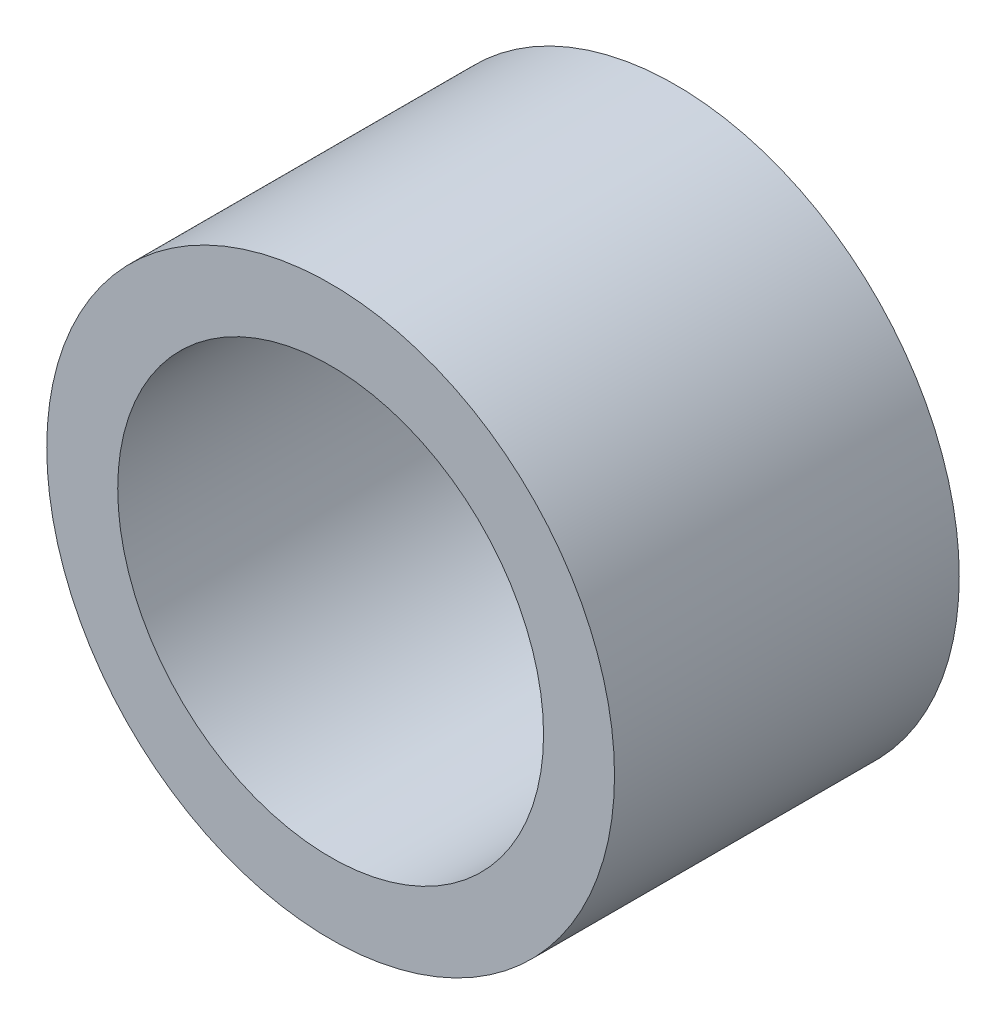
ISO-10303-21;
HEADER;
FILE_DESCRIPTION(('STEP AP214'),'2;1');
FILE_NAME('part.step','',(''),(''),'','','');
FILE_SCHEMA(('AUTOMOTIVE_DESIGN { 1 0 10303 214 1 1 1 1 }'));
ENDSEC;
DATA;
#1=APPLICATION_CONTEXT('core data for automotive mechanical design processes');
#2=APPLICATION_PROTOCOL_DEFINITION('international standard','automotive_design',2000,#1);
#3=PRODUCT_CONTEXT('',#1,'mechanical');
#4=PRODUCT('Part','Part','',(#3));
#5=PRODUCT_RELATED_PRODUCT_CATEGORY('part','',(#4));
#6=PRODUCT_DEFINITION_FORMATION('','',#4);
#7=PRODUCT_DEFINITION_CONTEXT('part definition',#1,'design');
#8=PRODUCT_DEFINITION('design','',#6,#7);
#9=PRODUCT_DEFINITION_SHAPE('','',#8);
#10=(LENGTH_UNIT() NAMED_UNIT(*) SI_UNIT(.MILLI.,.METRE.));
#11=(NAMED_UNIT(*) PLANE_ANGLE_UNIT() SI_UNIT($,.RADIAN.));
#12=(NAMED_UNIT(*) SI_UNIT($,.STERADIAN.) SOLID_ANGLE_UNIT());
#13=UNCERTAINTY_MEASURE_WITH_UNIT(LENGTH_MEASURE(1.E-05),#10,'distance_accuracy_value','');
#14=(GEOMETRIC_REPRESENTATION_CONTEXT(3) GLOBAL_UNCERTAINTY_ASSIGNED_CONTEXT((#13)) GLOBAL_UNIT_ASSIGNED_CONTEXT((#10,
#11,#12)) REPRESENTATION_CONTEXT('',''));
#15=CARTESIAN_POINT('',(0.,0.,0.));
#16=DIRECTION('',(0.,0.,1.));
#17=DIRECTION('',(1.,0.,0.));
#18=AXIS2_PLACEMENT_3D('',#15,#16,#17);
#19=CARTESIAN_POINT('',(0.,0.,8.5));
#20=DIRECTION('',(0.,0.,1.));
#21=DIRECTION('',(1.,0.,0.));
#22=AXIS2_PLACEMENT_3D('',#19,#20,#21);
#23=PLANE('',#22);
#24=CARTESIAN_POINT('',(0.,0.,8.5));
#25=DIRECTION('',(0.,0.,1.));
#26=DIRECTION('',(1.,0.,0.));
#27=AXIS2_PLACEMENT_3D('',#24,#25,#26);
#28=CIRCLE('',#27,7.);
#29=CARTESIAN_POINT('',(7.,0.,8.5));
#30=VERTEX_POINT('',#29);
#31=EDGE_CURVE('E10',#30,#30,#28,.T.);
#32=ORIENTED_EDGE('',*,*,#31,.T.);
#33=EDGE_LOOP('',(#32));
#34=FACE_BOUND('',#33,.T.);
#35=CARTESIAN_POINT('',(0.,0.,8.5));
#36=DIRECTION('',(0.,0.,1.));
#37=DIRECTION('',(1.,0.,0.));
#38=AXIS2_PLACEMENT_3D('',#35,#36,#37);
#39=CIRCLE('',#38,5.25);
#40=CARTESIAN_POINT('',(5.25,0.,8.5));
#41=VERTEX_POINT('',#40);
#42=EDGE_CURVE('E54',#41,#41,#39,.T.);
#43=ORIENTED_EDGE('',*,*,#42,.F.);
#44=EDGE_LOOP('',(#43));
#45=FACE_BOUND('',#44,.T.);
#46=ADVANCED_FACE('F41',(#34,#45),#23,.T.);
#47=CARTESIAN_POINT('',(0.,0.,0.));
#48=DIRECTION('',(0.,0.,1.));
#49=DIRECTION('',(1.,0.,0.));
#50=AXIS2_PLACEMENT_3D('',#47,#48,#49);
#51=PLANE('',#50);
#52=CARTESIAN_POINT('',(0.,0.,0.));
#53=DIRECTION('',(0.,0.,1.));
#54=DIRECTION('',(1.,0.,0.));
#55=AXIS2_PLACEMENT_3D('',#52,#53,#54);
#56=CIRCLE('',#55,7.);
#57=CARTESIAN_POINT('',(7.,0.,0.));
#58=VERTEX_POINT('',#57);
#59=EDGE_CURVE('E45',#58,#58,#56,.T.);
#60=ORIENTED_EDGE('',*,*,#59,.F.);
#61=EDGE_LOOP('',(#60));
#62=FACE_BOUND('',#61,.T.);
#63=CARTESIAN_POINT('',(0.,0.,0.));
#64=DIRECTION('',(0.,0.,1.));
#65=DIRECTION('',(1.,0.,0.));
#66=AXIS2_PLACEMENT_3D('',#63,#64,#65);
#67=CIRCLE('',#66,5.25);
#68=CARTESIAN_POINT('',(5.25,0.,0.));
#69=VERTEX_POINT('',#68);
#70=EDGE_CURVE('E56',#69,#69,#67,.T.);
#71=ORIENTED_EDGE('',*,*,#70,.T.);
#72=EDGE_LOOP('',(#71));
#73=FACE_BOUND('',#72,.T.);
#74=ADVANCED_FACE('F68',(#62,#73),#51,.F.);
#75=CARTESIAN_POINT('',(0.,0.,8.5));
#76=DIRECTION('',(0.,0.,-1.));
#77=DIRECTION('',(-1.,0.,0.));
#78=AXIS2_PLACEMENT_3D('',#75,#76,#77);
#79=CYLINDRICAL_SURFACE('',#78,7.);
#80=ORIENTED_EDGE('',*,*,#31,.F.);
#81=EDGE_LOOP('',(#80));
#82=FACE_BOUND('',#81,.T.);
#83=ORIENTED_EDGE('',*,*,#59,.T.);
#84=EDGE_LOOP('',(#83));
#85=FACE_BOUND('',#84,.T.);
#86=ADVANCED_FACE('F43',(#82,#85),#79,.T.);
#87=CARTESIAN_POINT('',(0.,0.,8.5));
#88=DIRECTION('',(0.,0.,-1.));
#89=DIRECTION('',(-1.,0.,0.));
#90=AXIS2_PLACEMENT_3D('',#87,#88,#89);
#91=CYLINDRICAL_SURFACE('',#90,5.25);
#92=ORIENTED_EDGE('',*,*,#42,.T.);
#93=EDGE_LOOP('',(#92));
#94=FACE_BOUND('',#93,.T.);
#95=ORIENTED_EDGE('',*,*,#70,.F.);
#96=EDGE_LOOP('',(#95));
#97=FACE_BOUND('',#96,.T.);
#98=ADVANCED_FACE('F64',(#94,#97),#91,.F.);
#99=CLOSED_SHELL('',(#46,#74,#86,#98));
#100=MANIFOLD_SOLID_BREP('B2',#99);
#101=ADVANCED_BREP_SHAPE_REPRESENTATION('',(#18,#100),#14);
#102=SHAPE_DEFINITION_REPRESENTATION(#9,#101);
ENDSEC;
END-ISO-10303-21;
